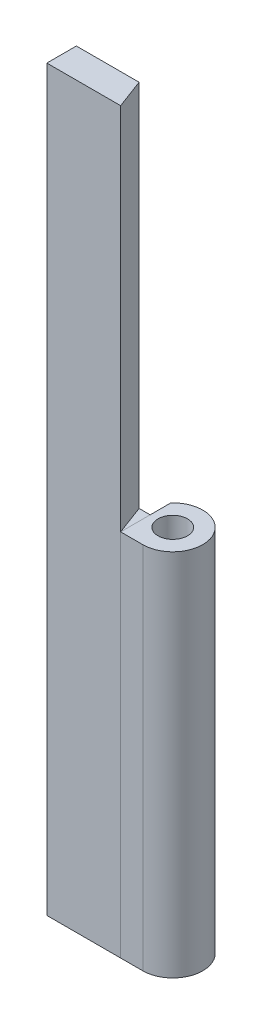
ISO-10303-21;
HEADER;
FILE_DESCRIPTION(('STEP AP214'),'2;1');
FILE_NAME('part.step','',(''),(''),'','','');
FILE_SCHEMA(('AUTOMOTIVE_DESIGN { 1 0 10303 214 1 1 1 1 }'));
ENDSEC;
DATA;
#1=APPLICATION_CONTEXT('core data for automotive mechanical design processes');
#2=APPLICATION_PROTOCOL_DEFINITION('international standard','automotive_design',2000,#1);
#3=PRODUCT_CONTEXT('',#1,'mechanical');
#4=PRODUCT('Part','Part','',(#3));
#5=PRODUCT_RELATED_PRODUCT_CATEGORY('part','',(#4));
#6=PRODUCT_DEFINITION_FORMATION('','',#4);
#7=PRODUCT_DEFINITION_CONTEXT('part definition',#1,'design');
#8=PRODUCT_DEFINITION('design','',#6,#7);
#9=PRODUCT_DEFINITION_SHAPE('','',#8);
#10=(LENGTH_UNIT() NAMED_UNIT(*) SI_UNIT(.MILLI.,.METRE.));
#11=(NAMED_UNIT(*) PLANE_ANGLE_UNIT() SI_UNIT($,.RADIAN.));
#12=(NAMED_UNIT(*) SI_UNIT($,.STERADIAN.) SOLID_ANGLE_UNIT());
#13=UNCERTAINTY_MEASURE_WITH_UNIT(LENGTH_MEASURE(1.E-05),#10,'distance_accuracy_value','');
#14=(GEOMETRIC_REPRESENTATION_CONTEXT(3) GLOBAL_UNCERTAINTY_ASSIGNED_CONTEXT((#13)) GLOBAL_UNIT_ASSIGNED_CONTEXT((#10,
#11,#12)) REPRESENTATION_CONTEXT('',''));
#15=CARTESIAN_POINT('',(0.,0.,0.));
#16=DIRECTION('',(0.,0.,1.));
#17=DIRECTION('',(1.,0.,0.));
#18=AXIS2_PLACEMENT_3D('',#15,#16,#17);
#19=CARTESIAN_POINT('',(0.,0.,-2.));
#20=DIRECTION('',(1.,0.,0.));
#21=DIRECTION('',(0.,1.,0.));
#22=AXIS2_PLACEMENT_3D('',#19,#20,#21);
#23=PLANE('',#22);
#24=DIRECTION('',(0.,-1.,0.));
#25=VECTOR('',#24,1.);
#26=CARTESIAN_POINT('',(0.,0.,0.));
#27=LINE('',#26,#25);
#28=CARTESIAN_POINT('',(0.,0.,0.));
#29=VERTEX_POINT('',#28);
#30=CARTESIAN_POINT('',(0.,-50.,0.));
#31=VERTEX_POINT('',#30);
#32=EDGE_CURVE('E127',#29,#31,#27,.T.);
#33=ORIENTED_EDGE('',*,*,#32,.F.);
#34=DIRECTION('',(0.,0.,1.));
#35=VECTOR('',#34,1.);
#36=CARTESIAN_POINT('',(0.,0.,-2.));
#37=LINE('',#36,#35);
#38=CARTESIAN_POINT('',(0.,0.,-2.));
#39=VERTEX_POINT('',#38);
#40=EDGE_CURVE('E119',#39,#29,#37,.T.);
#41=ORIENTED_EDGE('',*,*,#40,.F.);
#42=DIRECTION('',(0.,-1.,0.));
#43=VECTOR('',#42,1.);
#44=CARTESIAN_POINT('',(0.,0.,-2.));
#45=LINE('',#44,#43);
#46=CARTESIAN_POINT('',(0.,-50.,-2.));
#47=VERTEX_POINT('',#46);
#48=EDGE_CURVE('E117',#39,#47,#45,.T.);
#49=ORIENTED_EDGE('',*,*,#48,.T.);
#50=DIRECTION('',(0.,0.,1.));
#51=VECTOR('',#50,1.);
#52=CARTESIAN_POINT('',(0.,-50.,-2.));
#53=LINE('',#52,#51);
#54=EDGE_CURVE('E12',#47,#31,#53,.T.);
#55=ORIENTED_EDGE('',*,*,#54,.T.);
#56=EDGE_LOOP('',(#33,#41,#49,#55));
#57=FACE_BOUND('',#56,.T.);
#58=ADVANCED_FACE('F47',(#57),#23,.F.);
#59=CARTESIAN_POINT('',(0.,-50.,-2.));
#60=DIRECTION('',(0.,1.,0.));
#61=DIRECTION('',(0.,0.,-1.));
#62=AXIS2_PLACEMENT_3D('',#59,#60,#61);
#63=PLANE('',#62);
#64=DIRECTION('',(1.,0.,0.));
#65=VECTOR('',#64,1.);
#66=CARTESIAN_POINT('',(0.,-50.,0.));
#67=LINE('',#66,#65);
#68=CARTESIAN_POINT('',(5.00000000000001,-50.,0.));
#69=VERTEX_POINT('',#68);
#70=EDGE_CURVE('E129',#31,#69,#67,.T.);
#71=ORIENTED_EDGE('',*,*,#70,.F.);
#72=ORIENTED_EDGE('',*,*,#54,.F.);
#73=DIRECTION('',(1.,0.,0.));
#74=VECTOR('',#73,1.);
#75=CARTESIAN_POINT('',(0.,-50.,-2.));
#76=LINE('',#75,#74);
#77=CARTESIAN_POINT('',(5.00000000000001,-50.,-2.));
#78=VERTEX_POINT('',#77);
#79=EDGE_CURVE('E93',#47,#78,#76,.T.);
#80=ORIENTED_EDGE('',*,*,#79,.T.);
#81=DIRECTION('',(0.,0.,1.));
#82=VECTOR('',#81,1.);
#83=CARTESIAN_POINT('',(5.00000000000001,-50.,-2.));
#84=LINE('',#83,#82);
#85=EDGE_CURVE('E54',#78,#69,#84,.T.);
#86=ORIENTED_EDGE('',*,*,#85,.T.);
#87=EDGE_LOOP('',(#71,#72,#80,#86));
#88=FACE_BOUND('',#87,.T.);
#89=ADVANCED_FACE('F138',(#88),#63,.F.);
#90=CARTESIAN_POINT('',(5.,0.,-2.));
#91=DIRECTION('',(-1.,0.,0.));
#92=DIRECTION('',(0.,-1.,0.));
#93=AXIS2_PLACEMENT_3D('',#90,#91,#92);
#94=PLANE('',#93);
#95=DIRECTION('',(0.,1.,0.));
#96=VECTOR('',#95,1.);
#97=CARTESIAN_POINT('',(5.,0.,0.));
#98=LINE('',#97,#96);
#99=CARTESIAN_POINT('',(5.,-25.,0.));
#100=VERTEX_POINT('',#99);
#101=EDGE_CURVE('E132',#69,#100,#98,.T.);
#102=ORIENTED_EDGE('',*,*,#101,.F.);
#103=ORIENTED_EDGE('',*,*,#85,.F.);
#104=DIRECTION('',(0.,1.,0.));
#105=VECTOR('',#104,1.);
#106=CARTESIAN_POINT('',(5.,0.,-2.));
#107=LINE('',#106,#105);
#108=CARTESIAN_POINT('',(5.,-25.,-2.));
#109=VERTEX_POINT('',#108);
#110=EDGE_CURVE('E120',#78,#109,#107,.T.);
#111=ORIENTED_EDGE('',*,*,#110,.T.);
#112=DIRECTION('',(0.,0.,1.));
#113=VECTOR('',#112,1.);
#114=CARTESIAN_POINT('',(5.,-25.,-2.));
#115=LINE('',#114,#113);
#116=EDGE_CURVE('E113',#109,#100,#115,.T.);
#117=ORIENTED_EDGE('',*,*,#116,.T.);
#118=EDGE_LOOP('',(#102,#103,#111,#117));
#119=FACE_BOUND('',#118,.T.);
#120=ADVANCED_FACE('F150',(#119),#94,.F.);
#121=CARTESIAN_POINT('',(0.,0.,-2.));
#122=DIRECTION('',(0.,-1.,0.));
#123=DIRECTION('',(0.,0.,1.));
#124=AXIS2_PLACEMENT_3D('',#121,#122,#123);
#125=PLANE('',#124);
#126=DIRECTION('',(-1.,0.,0.));
#127=VECTOR('',#126,1.);
#128=CARTESIAN_POINT('',(0.,0.,-2.));
#129=LINE('',#128,#127);
#130=CARTESIAN_POINT('',(4.25,0.,-2.));
#131=VERTEX_POINT('',#130);
#132=EDGE_CURVE('E70',#131,#39,#129,.T.);
#133=ORIENTED_EDGE('',*,*,#132,.T.);
#134=ORIENTED_EDGE('',*,*,#40,.T.);
#135=DIRECTION('',(-1.,0.,0.));
#136=VECTOR('',#135,1.);
#137=CARTESIAN_POINT('',(0.,0.,0.));
#138=LINE('',#137,#136);
#139=CARTESIAN_POINT('',(5.,0.,0.));
#140=VERTEX_POINT('',#139);
#141=EDGE_CURVE('E89',#140,#29,#138,.T.);
#142=ORIENTED_EDGE('',*,*,#141,.F.);
#143=DIRECTION('',(-0.351123441588392,0.,-0.936329177569045));
#144=VECTOR('',#143,1.);
#145=CARTESIAN_POINT('',(5.,0.,0.));
#146=LINE('',#145,#144);
#147=EDGE_CURVE('E109',#140,#131,#146,.T.);
#148=ORIENTED_EDGE('',*,*,#147,.T.);
#149=EDGE_LOOP('',(#133,#134,#142,#148));
#150=FACE_BOUND('',#149,.T.);
#151=ADVANCED_FACE('F112',(#150),#125,.F.);
#152=CARTESIAN_POINT('',(0.,0.,-2.));
#153=DIRECTION('',(0.,0.,-1.));
#154=DIRECTION('',(1.,0.,0.));
#155=AXIS2_PLACEMENT_3D('',#152,#153,#154);
#156=PLANE('',#155);
#157=DIRECTION('',(1.,0.,0.));
#158=VECTOR('',#157,1.);
#159=CARTESIAN_POINT('',(4.25,-25.,-2.));
#160=LINE('',#159,#158);
#161=CARTESIAN_POINT('',(4.25,-25.,-2.));
#162=VERTEX_POINT('',#161);
#163=EDGE_CURVE('E110',#162,#109,#160,.T.);
#164=ORIENTED_EDGE('',*,*,#163,.T.);
#165=ORIENTED_EDGE('',*,*,#110,.F.);
#166=ORIENTED_EDGE('',*,*,#79,.F.);
#167=ORIENTED_EDGE('',*,*,#48,.F.);
#168=ORIENTED_EDGE('',*,*,#132,.F.);
#169=DIRECTION('',(0.,1.,0.));
#170=VECTOR('',#169,1.);
#171=CARTESIAN_POINT('',(4.25,-27.1360009363294,-2.));
#172=LINE('',#171,#170);
#173=EDGE_CURVE('E107',#162,#131,#172,.T.);
#174=ORIENTED_EDGE('',*,*,#173,.F.);
#175=EDGE_LOOP('',(#164,#165,#166,#167,#168,#174));
#176=FACE_BOUND('',#175,.T.);
#177=ADVANCED_FACE('F115',(#176),#156,.T.);
#178=CARTESIAN_POINT('',(0.,0.,0.));
#179=DIRECTION('',(0.,0.,-1.));
#180=DIRECTION('',(1.,0.,0.));
#181=AXIS2_PLACEMENT_3D('',#178,#179,#180);
#182=PLANE('',#181);
#183=ORIENTED_EDGE('',*,*,#32,.T.);
#184=ORIENTED_EDGE('',*,*,#70,.T.);
#185=ORIENTED_EDGE('',*,*,#101,.T.);
#186=DIRECTION('',(0.,1.,0.));
#187=VECTOR('',#186,1.);
#188=CARTESIAN_POINT('',(5.,-27.1360009363294,0.));
#189=LINE('',#188,#187);
#190=EDGE_CURVE('E145',#100,#140,#189,.T.);
#191=ORIENTED_EDGE('',*,*,#190,.T.);
#192=ORIENTED_EDGE('',*,*,#141,.T.);
#193=EDGE_LOOP('',(#183,#184,#185,#191,#192));
#194=FACE_BOUND('',#193,.T.);
#195=ADVANCED_FACE('F140',(#194),#182,.F.);
#196=CARTESIAN_POINT('',(6.5,-25.,-2.03088235294118));
#197=DIRECTION('',(0.,-1.,0.));
#198=DIRECTION('',(0.,0.,1.));
#199=AXIS2_PLACEMENT_3D('',#196,#197,#198);
#200=PLANE('',#199);
#201=ORIENTED_EDGE('',*,*,#163,.F.);
#202=DIRECTION('',(-0.351123441588392,0.,-0.936329177569045));
#203=VECTOR('',#202,1.);
#204=CARTESIAN_POINT('',(5.,-25.,0.));
#205=LINE('',#204,#203);
#206=EDGE_CURVE('E61',#100,#162,#205,.T.);
#207=ORIENTED_EDGE('',*,*,#206,.F.);
#208=ORIENTED_EDGE('',*,*,#116,.F.);
#209=EDGE_LOOP('',(#201,#207,#208));
#210=FACE_BOUND('',#209,.T.);
#211=ADVANCED_FACE('F151',(#210),#200,.F.);
#212=CARTESIAN_POINT('',(5.,-27.1360009363294,0.));
#213=DIRECTION('',(-0.936329177569044,0.,0.351123441588392));
#214=DIRECTION('',(-0.351123441588392,0.,-0.936329177569045));
#215=AXIS2_PLACEMENT_3D('',#212,#213,#214);
#216=PLANE('',#215);
#217=ORIENTED_EDGE('',*,*,#190,.F.);
#218=ORIENTED_EDGE('',*,*,#206,.T.);
#219=ORIENTED_EDGE('',*,*,#173,.T.);
#220=ORIENTED_EDGE('',*,*,#147,.F.);
#221=EDGE_LOOP('',(#217,#218,#219,#220));
#222=FACE_BOUND('',#221,.T.);
#223=ADVANCED_FACE('F108',(#222),#216,.F.);
#224=CLOSED_SHELL('',(#58,#89,#120,#151,#177,#195,#211,#223));
#225=MANIFOLD_SOLID_BREP('B2',#224);
#226=CARTESIAN_POINT('',(5.,-25.,-3.4));
#227=DIRECTION('',(-1.,0.,0.));
#228=DIRECTION('',(0.,0.,-1.));
#229=AXIS2_PLACEMENT_3D('',#226,#227,#228);
#230=PLANE('',#229);
#231=DIRECTION('',(0.,0.,1.));
#232=VECTOR('',#231,1.);
#233=CARTESIAN_POINT('',(5.,-50.,-3.4));
#234=LINE('',#233,#232);
#235=CARTESIAN_POINT('',(5.,-50.,-3.4));
#236=VERTEX_POINT('',#235);
#237=CARTESIAN_POINT('',(5.,-50.,0.));
#238=VERTEX_POINT('',#237);
#239=EDGE_CURVE('E266',#236,#238,#234,.T.);
#240=ORIENTED_EDGE('',*,*,#239,.T.);
#241=DIRECTION('',(0.,-1.,0.));
#242=VECTOR('',#241,1.);
#243=CARTESIAN_POINT('',(5.,-25.,0.));
#244=LINE('',#243,#242);
#245=CARTESIAN_POINT('',(5.,-25.,0.));
#246=VERTEX_POINT('',#245);
#247=EDGE_CURVE('E220',#246,#238,#244,.T.);
#248=ORIENTED_EDGE('',*,*,#247,.F.);
#249=DIRECTION('',(0.,0.,1.));
#250=VECTOR('',#249,1.);
#251=CARTESIAN_POINT('',(5.,-25.,-3.4));
#252=LINE('',#251,#250);
#253=CARTESIAN_POINT('',(5.,-25.,-3.4));
#254=VERTEX_POINT('',#253);
#255=EDGE_CURVE('E259',#254,#246,#252,.T.);
#256=ORIENTED_EDGE('',*,*,#255,.F.);
#257=DIRECTION('',(0.,-1.,0.));
#258=VECTOR('',#257,1.);
#259=CARTESIAN_POINT('',(5.,-25.,-3.4));
#260=LINE('',#259,#258);
#261=EDGE_CURVE('E45',#254,#236,#260,.T.);
#262=ORIENTED_EDGE('',*,*,#261,.T.);
#263=EDGE_LOOP('',(#240,#248,#256,#262));
#264=FACE_BOUND('',#263,.T.);
#265=ADVANCED_FACE('F217',(#264),#230,.T.);
#266=CARTESIAN_POINT('',(6.5,-25.,-2.03088235294118));
#267=DIRECTION('',(0.,-1.,0.));
#268=DIRECTION('',(0.,0.,1.));
#269=AXIS2_PLACEMENT_3D('',#266,#267,#268);
#270=CYLINDRICAL_SURFACE('',#269,2.03088235294118);
#271=CARTESIAN_POINT('',(6.5,-50.,-2.03088235294118));
#272=DIRECTION('',(0.,1.,0.));
#273=DIRECTION('',(0.,0.,1.));
#274=AXIS2_PLACEMENT_3D('',#271,#272,#273);
#275=CIRCLE('',#274,2.03088235294118);
#276=CARTESIAN_POINT('',(6.5,-50.,0.));
#277=VERTEX_POINT('',#276);
#278=EDGE_CURVE('E253',#277,#236,#275,.T.);
#279=ORIENTED_EDGE('',*,*,#278,.T.);
#280=ORIENTED_EDGE('',*,*,#261,.F.);
#281=CARTESIAN_POINT('',(6.5,-25.,-2.03088235294118));
#282=DIRECTION('',(0.,1.,0.));
#283=DIRECTION('',(0.,0.,1.));
#284=AXIS2_PLACEMENT_3D('',#281,#282,#283);
#285=CIRCLE('',#284,2.03088235294118);
#286=CARTESIAN_POINT('',(6.5,-25.,0.));
#287=VERTEX_POINT('',#286);
#288=EDGE_CURVE('E235',#287,#254,#285,.T.);
#289=ORIENTED_EDGE('',*,*,#288,.F.);
#290=DIRECTION('',(0.,-1.,0.));
#291=VECTOR('',#290,1.);
#292=CARTESIAN_POINT('',(6.5,-25.,0.));
#293=LINE('',#292,#291);
#294=EDGE_CURVE('E226',#287,#277,#293,.T.);
#295=ORIENTED_EDGE('',*,*,#294,.T.);
#296=EDGE_LOOP('',(#279,#280,#289,#295));
#297=FACE_BOUND('',#296,.T.);
#298=ADVANCED_FACE('F293',(#297),#270,.T.);
#299=CARTESIAN_POINT('',(5.,-25.,0.));
#300=DIRECTION('',(0.,0.,1.));
#301=DIRECTION('',(-1.,0.,0.));
#302=AXIS2_PLACEMENT_3D('',#299,#300,#301);
#303=PLANE('',#302);
#304=DIRECTION('',(1.,0.,0.));
#305=VECTOR('',#304,1.);
#306=CARTESIAN_POINT('',(5.,-50.,0.));
#307=LINE('',#306,#305);
#308=EDGE_CURVE('E248',#238,#277,#307,.T.);
#309=ORIENTED_EDGE('',*,*,#308,.T.);
#310=ORIENTED_EDGE('',*,*,#294,.F.);
#311=DIRECTION('',(1.,0.,0.));
#312=VECTOR('',#311,1.);
#313=CARTESIAN_POINT('',(5.,-25.,0.));
#314=LINE('',#313,#312);
#315=EDGE_CURVE('E255',#246,#287,#314,.T.);
#316=ORIENTED_EDGE('',*,*,#315,.F.);
#317=ORIENTED_EDGE('',*,*,#247,.T.);
#318=EDGE_LOOP('',(#309,#310,#316,#317));
#319=FACE_BOUND('',#318,.T.);
#320=ADVANCED_FACE('F256',(#319),#303,.T.);
#321=CARTESIAN_POINT('',(6.5,-25.,-2.03088235294118));
#322=DIRECTION('',(0.,-1.,0.));
#323=DIRECTION('',(0.,0.,1.));
#324=AXIS2_PLACEMENT_3D('',#321,#322,#323);
#325=PLANE('',#324);
#326=CARTESIAN_POINT('',(6.5,-25.,-2.03088235294118));
#327=DIRECTION('',(0.,1.,0.));
#328=DIRECTION('',(0.,0.,1.));
#329=AXIS2_PLACEMENT_3D('',#326,#327,#328);
#330=CIRCLE('',#329,1.);
#331=CARTESIAN_POINT('',(6.5,-25.,-1.03088235294117));
#332=VERTEX_POINT('',#331);
#333=EDGE_CURVE('E270',#332,#332,#330,.T.);
#334=ORIENTED_EDGE('',*,*,#333,.F.);
#335=EDGE_LOOP('',(#334));
#336=FACE_BOUND('',#335,.T.);
#337=ORIENTED_EDGE('',*,*,#255,.T.);
#338=ORIENTED_EDGE('',*,*,#315,.T.);
#339=ORIENTED_EDGE('',*,*,#288,.T.);
#340=EDGE_LOOP('',(#337,#338,#339));
#341=FACE_BOUND('',#340,.T.);
#342=ADVANCED_FACE('F262',(#336,#341),#325,.F.);
#343=CARTESIAN_POINT('',(6.5,-50.,-2.03088235294118));
#344=DIRECTION('',(0.,-1.,0.));
#345=DIRECTION('',(0.,0.,1.));
#346=AXIS2_PLACEMENT_3D('',#343,#344,#345);
#347=PLANE('',#346);
#348=CARTESIAN_POINT('',(6.5,-50.,-2.03088235294118));
#349=DIRECTION('',(0.,1.,0.));
#350=DIRECTION('',(0.,0.,1.));
#351=AXIS2_PLACEMENT_3D('',#348,#349,#350);
#352=CIRCLE('',#351,1.);
#353=CARTESIAN_POINT('',(6.5,-50.,-1.03088235294117));
#354=VERTEX_POINT('',#353);
#355=EDGE_CURVE('E273',#354,#354,#352,.T.);
#356=ORIENTED_EDGE('',*,*,#355,.T.);
#357=EDGE_LOOP('',(#356));
#358=FACE_BOUND('',#357,.T.);
#359=ORIENTED_EDGE('',*,*,#239,.F.);
#360=ORIENTED_EDGE('',*,*,#278,.F.);
#361=ORIENTED_EDGE('',*,*,#308,.F.);
#362=EDGE_LOOP('',(#359,#360,#361));
#363=FACE_BOUND('',#362,.T.);
#364=ADVANCED_FACE('F281',(#358,#363),#347,.T.);
#365=CARTESIAN_POINT('',(6.5,0.,-2.03088235294118));
#366=DIRECTION('',(0.,-1.,0.));
#367=DIRECTION('',(0.,0.,1.));
#368=AXIS2_PLACEMENT_3D('',#365,#366,#367);
#369=CYLINDRICAL_SURFACE('',#368,1.);
#370=ORIENTED_EDGE('',*,*,#355,.F.);
#371=EDGE_LOOP('',(#370));
#372=FACE_BOUND('',#371,.T.);
#373=ORIENTED_EDGE('',*,*,#333,.T.);
#374=EDGE_LOOP('',(#373));
#375=FACE_BOUND('',#374,.T.);
#376=ADVANCED_FACE('F284',(#372,#375),#369,.F.);
#377=CLOSED_SHELL('',(#265,#298,#320,#342,#364,#376));
#378=MANIFOLD_SOLID_BREP('B6',#377);
#379=ADVANCED_BREP_SHAPE_REPRESENTATION('',(#18,#225,#378),#14);
#380=SHAPE_DEFINITION_REPRESENTATION(#9,#379);
ENDSEC;
END-ISO-10303-21;
